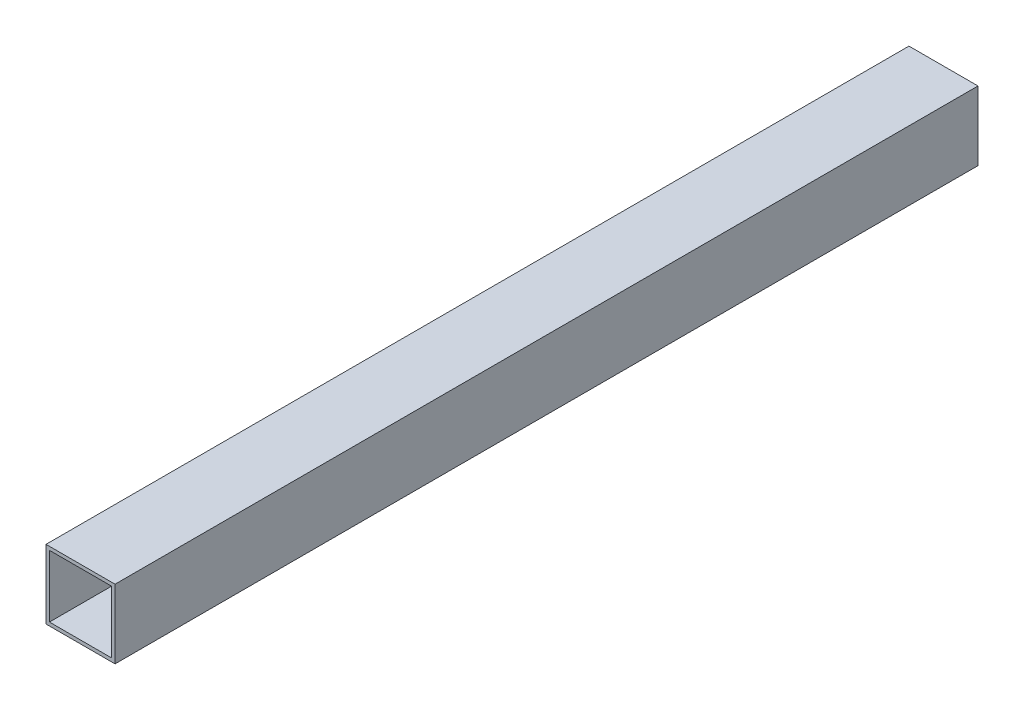
ISO-10303-21;
HEADER;
FILE_DESCRIPTION(('STEP AP214'),'2;1');
FILE_NAME('part.step','',(''),(''),'','','');
FILE_SCHEMA(('AUTOMOTIVE_DESIGN { 1 0 10303 214 1 1 1 1 }'));
ENDSEC;
DATA;
#1=APPLICATION_CONTEXT('core data for automotive mechanical design processes');
#2=APPLICATION_PROTOCOL_DEFINITION('international standard','automotive_design',2000,#1);
#3=PRODUCT_CONTEXT('',#1,'mechanical');
#4=PRODUCT('Part','Part','',(#3));
#5=PRODUCT_RELATED_PRODUCT_CATEGORY('part','',(#4));
#6=PRODUCT_DEFINITION_FORMATION('','',#4);
#7=PRODUCT_DEFINITION_CONTEXT('part definition',#1,'design');
#8=PRODUCT_DEFINITION('design','',#6,#7);
#9=PRODUCT_DEFINITION_SHAPE('','',#8);
#10=(LENGTH_UNIT() NAMED_UNIT(*) SI_UNIT(.MILLI.,.METRE.));
#11=(NAMED_UNIT(*) PLANE_ANGLE_UNIT() SI_UNIT($,.RADIAN.));
#12=(NAMED_UNIT(*) SI_UNIT($,.STERADIAN.) SOLID_ANGLE_UNIT());
#13=UNCERTAINTY_MEASURE_WITH_UNIT(LENGTH_MEASURE(1.E-05),#10,'distance_accuracy_value','');
#14=(GEOMETRIC_REPRESENTATION_CONTEXT(3) GLOBAL_UNCERTAINTY_ASSIGNED_CONTEXT((#13)) GLOBAL_UNIT_ASSIGNED_CONTEXT((#10,
#11,#12)) REPRESENTATION_CONTEXT('',''));
#15=CARTESIAN_POINT('',(0.,0.,0.));
#16=DIRECTION('',(0.,0.,1.));
#17=DIRECTION('',(1.,0.,0.));
#18=AXIS2_PLACEMENT_3D('',#15,#16,#17);
#19=CARTESIAN_POINT('',(0.,0.,500.));
#20=DIRECTION('',(0.,0.,-1.));
#21=DIRECTION('',(-1.,0.,0.));
#22=AXIS2_PLACEMENT_3D('',#19,#20,#21);
#23=PLANE('',#22);
#24=DIRECTION('',(0.,-1.,0.));
#25=VECTOR('',#24,1.);
#26=CARTESIAN_POINT('',(-20.,-20.,500.));
#27=LINE('',#26,#25);
#28=CARTESIAN_POINT('',(-20.,20.,500.));
#29=VERTEX_POINT('',#28);
#30=CARTESIAN_POINT('',(-20.,-20.,500.));
#31=VERTEX_POINT('',#30);
#32=EDGE_CURVE('E142',#29,#31,#27,.T.);
#33=ORIENTED_EDGE('',*,*,#32,.T.);
#34=DIRECTION('',(1.,0.,0.));
#35=VECTOR('',#34,1.);
#36=CARTESIAN_POINT('',(-20.,-20.,500.));
#37=LINE('',#36,#35);
#38=CARTESIAN_POINT('',(20.,-20.,500.));
#39=VERTEX_POINT('',#38);
#40=EDGE_CURVE('E145',#31,#39,#37,.T.);
#41=ORIENTED_EDGE('',*,*,#40,.T.);
#42=DIRECTION('',(0.,1.,0.));
#43=VECTOR('',#42,1.);
#44=CARTESIAN_POINT('',(20.,-20.,500.));
#45=LINE('',#44,#43);
#46=CARTESIAN_POINT('',(20.,20.,500.));
#47=VERTEX_POINT('',#46);
#48=EDGE_CURVE('E148',#39,#47,#45,.T.);
#49=ORIENTED_EDGE('',*,*,#48,.T.);
#50=DIRECTION('',(-1.,0.,0.));
#51=VECTOR('',#50,1.);
#52=CARTESIAN_POINT('',(-20.,20.,500.));
#53=LINE('',#52,#51);
#54=EDGE_CURVE('E150',#47,#29,#53,.T.);
#55=ORIENTED_EDGE('',*,*,#54,.T.);
#56=EDGE_LOOP('',(#33,#41,#49,#55));
#57=FACE_BOUND('',#56,.T.);
#58=DIRECTION('',(0.,-1.,0.));
#59=VECTOR('',#58,1.);
#60=CARTESIAN_POINT('',(-18.,-18.,500.));
#61=LINE('',#60,#59);
#62=CARTESIAN_POINT('',(-18.,18.,500.));
#63=VERTEX_POINT('',#62);
#64=CARTESIAN_POINT('',(-18.,-18.,500.));
#65=VERTEX_POINT('',#64);
#66=EDGE_CURVE('E106',#63,#65,#61,.T.);
#67=ORIENTED_EDGE('',*,*,#66,.F.);
#68=DIRECTION('',(-1.,0.,0.));
#69=VECTOR('',#68,1.);
#70=CARTESIAN_POINT('',(-18.,18.,500.));
#71=LINE('',#70,#69);
#72=CARTESIAN_POINT('',(18.,18.,500.));
#73=VERTEX_POINT('',#72);
#74=EDGE_CURVE('E128',#73,#63,#71,.T.);
#75=ORIENTED_EDGE('',*,*,#74,.F.);
#76=DIRECTION('',(0.,1.,0.));
#77=VECTOR('',#76,1.);
#78=CARTESIAN_POINT('',(18.,-18.,500.));
#79=LINE('',#78,#77);
#80=CARTESIAN_POINT('',(18.,-18.,500.));
#81=VERTEX_POINT('',#80);
#82=EDGE_CURVE('E126',#81,#73,#79,.T.);
#83=ORIENTED_EDGE('',*,*,#82,.F.);
#84=DIRECTION('',(1.,0.,0.));
#85=VECTOR('',#84,1.);
#86=CARTESIAN_POINT('',(-18.,-18.,500.));
#87=LINE('',#86,#85);
#88=EDGE_CURVE('E114',#65,#81,#87,.T.);
#89=ORIENTED_EDGE('',*,*,#88,.F.);
#90=EDGE_LOOP('',(#67,#75,#83,#89));
#91=FACE_BOUND('',#90,.T.);
#92=ADVANCED_FACE('F41',(#57,#91),#23,.F.);
#93=CARTESIAN_POINT('',(0.,0.,0.));
#94=DIRECTION('',(0.,0.,-1.));
#95=DIRECTION('',(-1.,0.,0.));
#96=AXIS2_PLACEMENT_3D('',#93,#94,#95);
#97=PLANE('',#96);
#98=DIRECTION('',(0.,-1.,0.));
#99=VECTOR('',#98,1.);
#100=CARTESIAN_POINT('',(-20.,-20.,0.));
#101=LINE('',#100,#99);
#102=CARTESIAN_POINT('',(-20.,20.,0.));
#103=VERTEX_POINT('',#102);
#104=CARTESIAN_POINT('',(-20.,-20.,0.));
#105=VERTEX_POINT('',#104);
#106=EDGE_CURVE('E122',#103,#105,#101,.T.);
#107=ORIENTED_EDGE('',*,*,#106,.F.);
#108=DIRECTION('',(-1.,0.,0.));
#109=VECTOR('',#108,1.);
#110=CARTESIAN_POINT('',(-20.,20.,0.));
#111=LINE('',#110,#109);
#112=CARTESIAN_POINT('',(20.,20.,0.));
#113=VERTEX_POINT('',#112);
#114=EDGE_CURVE('E146',#113,#103,#111,.T.);
#115=ORIENTED_EDGE('',*,*,#114,.F.);
#116=DIRECTION('',(0.,1.,0.));
#117=VECTOR('',#116,1.);
#118=CARTESIAN_POINT('',(20.,-20.,0.));
#119=LINE('',#118,#117);
#120=CARTESIAN_POINT('',(20.,-20.,0.));
#121=VERTEX_POINT('',#120);
#122=EDGE_CURVE('E157',#121,#113,#119,.T.);
#123=ORIENTED_EDGE('',*,*,#122,.F.);
#124=DIRECTION('',(1.,0.,0.));
#125=VECTOR('',#124,1.);
#126=CARTESIAN_POINT('',(-20.,-20.,0.));
#127=LINE('',#126,#125);
#128=EDGE_CURVE('E155',#105,#121,#127,.T.);
#129=ORIENTED_EDGE('',*,*,#128,.F.);
#130=EDGE_LOOP('',(#107,#115,#123,#129));
#131=FACE_BOUND('',#130,.T.);
#132=DIRECTION('',(-1.,0.,0.));
#133=VECTOR('',#132,1.);
#134=CARTESIAN_POINT('',(-18.,18.,0.));
#135=LINE('',#134,#133);
#136=CARTESIAN_POINT('',(18.,18.,0.));
#137=VERTEX_POINT('',#136);
#138=CARTESIAN_POINT('',(-18.,18.,0.));
#139=VERTEX_POINT('',#138);
#140=EDGE_CURVE('E115',#137,#139,#135,.T.);
#141=ORIENTED_EDGE('',*,*,#140,.T.);
#142=DIRECTION('',(0.,-1.,0.));
#143=VECTOR('',#142,1.);
#144=CARTESIAN_POINT('',(-18.,-18.,0.));
#145=LINE('',#144,#143);
#146=CARTESIAN_POINT('',(-18.,-18.,0.));
#147=VERTEX_POINT('',#146);
#148=EDGE_CURVE('E64',#139,#147,#145,.T.);
#149=ORIENTED_EDGE('',*,*,#148,.T.);
#150=DIRECTION('',(1.,0.,0.));
#151=VECTOR('',#150,1.);
#152=CARTESIAN_POINT('',(-18.,-18.,0.));
#153=LINE('',#152,#151);
#154=CARTESIAN_POINT('',(18.,-18.,0.));
#155=VERTEX_POINT('',#154);
#156=EDGE_CURVE('E121',#147,#155,#153,.T.);
#157=ORIENTED_EDGE('',*,*,#156,.T.);
#158=DIRECTION('',(0.,1.,0.));
#159=VECTOR('',#158,1.);
#160=CARTESIAN_POINT('',(18.,-18.,0.));
#161=LINE('',#160,#159);
#162=EDGE_CURVE('E134',#155,#137,#161,.T.);
#163=ORIENTED_EDGE('',*,*,#162,.T.);
#164=EDGE_LOOP('',(#141,#149,#157,#163));
#165=FACE_BOUND('',#164,.T.);
#166=ADVANCED_FACE('F175',(#131,#165),#97,.T.);
#167=CARTESIAN_POINT('',(-20.,-20.,500.));
#168=DIRECTION('',(1.,0.,0.));
#169=DIRECTION('',(0.,0.,-1.));
#170=AXIS2_PLACEMENT_3D('',#167,#168,#169);
#171=PLANE('',#170);
#172=ORIENTED_EDGE('',*,*,#106,.T.);
#173=DIRECTION('',(0.,0.,-1.));
#174=VECTOR('',#173,1.);
#175=CARTESIAN_POINT('',(-20.,-20.,500.));
#176=LINE('',#175,#174);
#177=EDGE_CURVE('E11',#31,#105,#176,.T.);
#178=ORIENTED_EDGE('',*,*,#177,.F.);
#179=ORIENTED_EDGE('',*,*,#32,.F.);
#180=DIRECTION('',(0.,0.,-1.));
#181=VECTOR('',#180,1.);
#182=CARTESIAN_POINT('',(-20.,20.,500.));
#183=LINE('',#182,#181);
#184=EDGE_CURVE('E152',#29,#103,#183,.T.);
#185=ORIENTED_EDGE('',*,*,#184,.T.);
#186=EDGE_LOOP('',(#172,#178,#179,#185));
#187=FACE_BOUND('',#186,.T.);
#188=ADVANCED_FACE('F43',(#187),#171,.F.);
#189=CARTESIAN_POINT('',(-20.,-20.,500.));
#190=DIRECTION('',(0.,1.,0.));
#191=DIRECTION('',(0.,0.,1.));
#192=AXIS2_PLACEMENT_3D('',#189,#190,#191);
#193=PLANE('',#192);
#194=ORIENTED_EDGE('',*,*,#128,.T.);
#195=DIRECTION('',(0.,0.,-1.));
#196=VECTOR('',#195,1.);
#197=CARTESIAN_POINT('',(20.,-20.,500.));
#198=LINE('',#197,#196);
#199=EDGE_CURVE('E49',#39,#121,#198,.T.);
#200=ORIENTED_EDGE('',*,*,#199,.F.);
#201=ORIENTED_EDGE('',*,*,#40,.F.);
#202=ORIENTED_EDGE('',*,*,#177,.T.);
#203=EDGE_LOOP('',(#194,#200,#201,#202));
#204=FACE_BOUND('',#203,.T.);
#205=ADVANCED_FACE('F185',(#204),#193,.F.);
#206=CARTESIAN_POINT('',(20.,-20.,500.));
#207=DIRECTION('',(-1.,0.,0.));
#208=DIRECTION('',(0.,0.,1.));
#209=AXIS2_PLACEMENT_3D('',#206,#207,#208);
#210=PLANE('',#209);
#211=ORIENTED_EDGE('',*,*,#122,.T.);
#212=DIRECTION('',(0.,0.,-1.));
#213=VECTOR('',#212,1.);
#214=CARTESIAN_POINT('',(20.,20.,500.));
#215=LINE('',#214,#213);
#216=EDGE_CURVE('E162',#47,#113,#215,.T.);
#217=ORIENTED_EDGE('',*,*,#216,.F.);
#218=ORIENTED_EDGE('',*,*,#48,.F.);
#219=ORIENTED_EDGE('',*,*,#199,.T.);
#220=EDGE_LOOP('',(#211,#217,#218,#219));
#221=FACE_BOUND('',#220,.T.);
#222=ADVANCED_FACE('F169',(#221),#210,.F.);
#223=CARTESIAN_POINT('',(-20.,20.,500.));
#224=DIRECTION('',(0.,-1.,0.));
#225=DIRECTION('',(0.,0.,-1.));
#226=AXIS2_PLACEMENT_3D('',#223,#224,#225);
#227=PLANE('',#226);
#228=ORIENTED_EDGE('',*,*,#114,.T.);
#229=ORIENTED_EDGE('',*,*,#184,.F.);
#230=ORIENTED_EDGE('',*,*,#54,.F.);
#231=ORIENTED_EDGE('',*,*,#216,.T.);
#232=EDGE_LOOP('',(#228,#229,#230,#231));
#233=FACE_BOUND('',#232,.T.);
#234=ADVANCED_FACE('F179',(#233),#227,.F.);
#235=CARTESIAN_POINT('',(-18.,-18.,500.));
#236=DIRECTION('',(1.,0.,0.));
#237=DIRECTION('',(0.,0.,-1.));
#238=AXIS2_PLACEMENT_3D('',#235,#236,#237);
#239=PLANE('',#238);
#240=ORIENTED_EDGE('',*,*,#148,.F.);
#241=DIRECTION('',(0.,0.,-1.));
#242=VECTOR('',#241,1.);
#243=CARTESIAN_POINT('',(-18.,18.,500.));
#244=LINE('',#243,#242);
#245=EDGE_CURVE('E110',#63,#139,#244,.T.);
#246=ORIENTED_EDGE('',*,*,#245,.F.);
#247=ORIENTED_EDGE('',*,*,#66,.T.);
#248=DIRECTION('',(0.,0.,-1.));
#249=VECTOR('',#248,1.);
#250=CARTESIAN_POINT('',(-18.,-18.,500.));
#251=LINE('',#250,#249);
#252=EDGE_CURVE('E109',#65,#147,#251,.T.);
#253=ORIENTED_EDGE('',*,*,#252,.T.);
#254=EDGE_LOOP('',(#240,#246,#247,#253));
#255=FACE_BOUND('',#254,.T.);
#256=ADVANCED_FACE('F108',(#255),#239,.T.);
#257=CARTESIAN_POINT('',(-18.,-18.,500.));
#258=DIRECTION('',(0.,1.,0.));
#259=DIRECTION('',(0.,0.,1.));
#260=AXIS2_PLACEMENT_3D('',#257,#258,#259);
#261=PLANE('',#260);
#262=ORIENTED_EDGE('',*,*,#156,.F.);
#263=ORIENTED_EDGE('',*,*,#252,.F.);
#264=ORIENTED_EDGE('',*,*,#88,.T.);
#265=DIRECTION('',(0.,0.,-1.));
#266=VECTOR('',#265,1.);
#267=CARTESIAN_POINT('',(18.,-18.,500.));
#268=LINE('',#267,#266);
#269=EDGE_CURVE('E123',#81,#155,#268,.T.);
#270=ORIENTED_EDGE('',*,*,#269,.T.);
#271=EDGE_LOOP('',(#262,#263,#264,#270));
#272=FACE_BOUND('',#271,.T.);
#273=ADVANCED_FACE('F118',(#272),#261,.T.);
#274=CARTESIAN_POINT('',(18.,-18.,500.));
#275=DIRECTION('',(-1.,0.,0.));
#276=DIRECTION('',(0.,0.,1.));
#277=AXIS2_PLACEMENT_3D('',#274,#275,#276);
#278=PLANE('',#277);
#279=ORIENTED_EDGE('',*,*,#162,.F.);
#280=ORIENTED_EDGE('',*,*,#269,.F.);
#281=ORIENTED_EDGE('',*,*,#82,.T.);
#282=DIRECTION('',(0.,0.,-1.));
#283=VECTOR('',#282,1.);
#284=CARTESIAN_POINT('',(18.,18.,500.));
#285=LINE('',#284,#283);
#286=EDGE_CURVE('E56',#73,#137,#285,.T.);
#287=ORIENTED_EDGE('',*,*,#286,.T.);
#288=EDGE_LOOP('',(#279,#280,#281,#287));
#289=FACE_BOUND('',#288,.T.);
#290=ADVANCED_FACE('F208',(#289),#278,.T.);
#291=CARTESIAN_POINT('',(-18.,18.,500.));
#292=DIRECTION('',(0.,-1.,0.));
#293=DIRECTION('',(0.,0.,-1.));
#294=AXIS2_PLACEMENT_3D('',#291,#292,#293);
#295=PLANE('',#294);
#296=ORIENTED_EDGE('',*,*,#140,.F.);
#297=ORIENTED_EDGE('',*,*,#286,.F.);
#298=ORIENTED_EDGE('',*,*,#74,.T.);
#299=ORIENTED_EDGE('',*,*,#245,.T.);
#300=EDGE_LOOP('',(#296,#297,#298,#299));
#301=FACE_BOUND('',#300,.T.);
#302=ADVANCED_FACE('F212',(#301),#295,.T.);
#303=CLOSED_SHELL('',(#92,#166,#188,#205,#222,#234,#256,#273,#290,#302));
#304=MANIFOLD_SOLID_BREP('B2',#303);
#305=ADVANCED_BREP_SHAPE_REPRESENTATION('',(#18,#304),#14);
#306=SHAPE_DEFINITION_REPRESENTATION(#9,#305);
ENDSEC;
END-ISO-10303-21;
